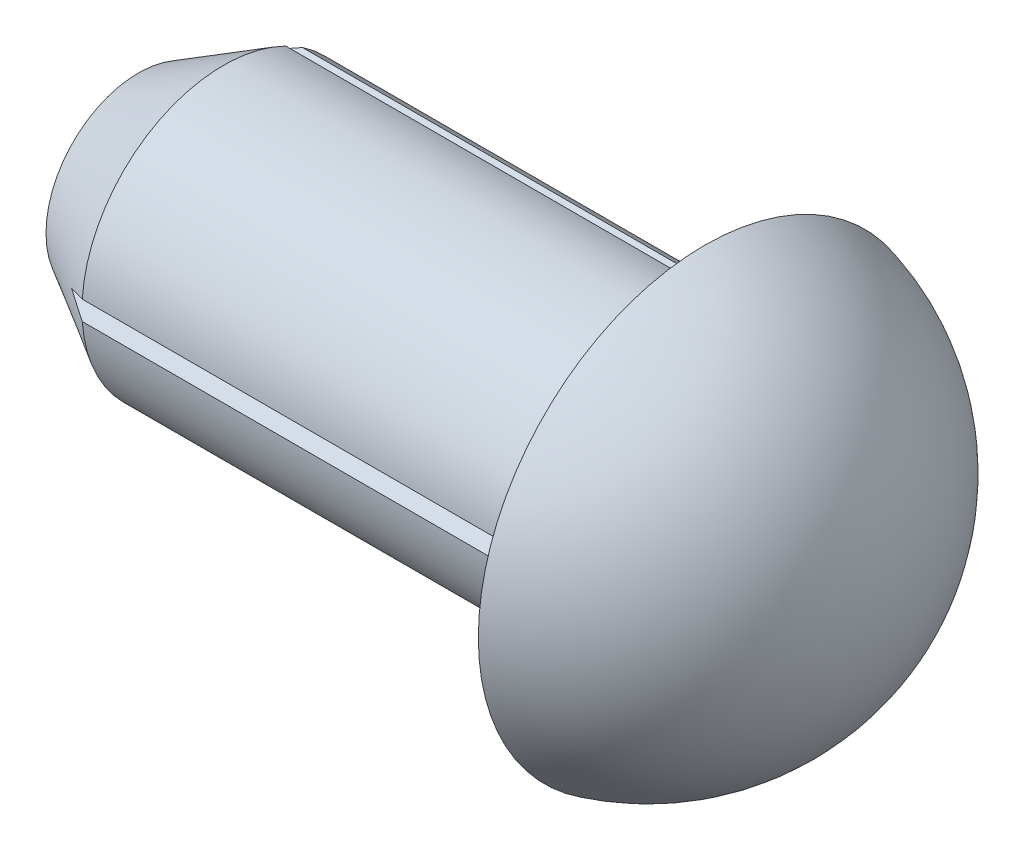
ISO-10303-21;
HEADER;
FILE_DESCRIPTION(('STEP AP214'),'2;1');
FILE_NAME('part.step','',(''),(''),'','','');
FILE_SCHEMA(('AUTOMOTIVE_DESIGN { 1 0 10303 214 1 1 1 1 }'));
ENDSEC;
DATA;
#1=APPLICATION_CONTEXT('core data for automotive mechanical design processes');
#2=APPLICATION_PROTOCOL_DEFINITION('international standard','automotive_design',2000,#1);
#3=PRODUCT_CONTEXT('',#1,'mechanical');
#4=PRODUCT('Part','Part','',(#3));
#5=PRODUCT_RELATED_PRODUCT_CATEGORY('part','',(#4));
#6=PRODUCT_DEFINITION_FORMATION('','',#4);
#7=PRODUCT_DEFINITION_CONTEXT('part definition',#1,'design');
#8=PRODUCT_DEFINITION('design','',#6,#7);
#9=PRODUCT_DEFINITION_SHAPE('','',#8);
#10=(LENGTH_UNIT() NAMED_UNIT(*) SI_UNIT(.MILLI.,.METRE.));
#11=(NAMED_UNIT(*) PLANE_ANGLE_UNIT() SI_UNIT($,.RADIAN.));
#12=(NAMED_UNIT(*) SI_UNIT($,.STERADIAN.) SOLID_ANGLE_UNIT());
#13=UNCERTAINTY_MEASURE_WITH_UNIT(LENGTH_MEASURE(1.E-05),#10,'distance_accuracy_value','');
#14=(GEOMETRIC_REPRESENTATION_CONTEXT(3) GLOBAL_UNCERTAINTY_ASSIGNED_CONTEXT((#13)) GLOBAL_UNIT_ASSIGNED_CONTEXT((#10,
#11,#12)) REPRESENTATION_CONTEXT('',''));
#15=CARTESIAN_POINT('',(0.,0.,0.));
#16=DIRECTION('',(0.,0.,1.));
#17=DIRECTION('',(1.,0.,0.));
#18=AXIS2_PLACEMENT_3D('',#15,#16,#17);
#19=CARTESIAN_POINT('',(-4.03112887414926,0.,0.));
#20=DIRECTION('',(-1.,0.,0.));
#21=DIRECTION('',(0.,1.,0.));
#22=AXIS2_PLACEMENT_3D('',#19,#20,#21);
#23=SPHERICAL_SURFACE('',#22,16.5);
#24=CARTESIAN_POINT('',(0.,0.,0.));
#25=DIRECTION('',(-1.,0.,0.));
#26=DIRECTION('',(0.,0.,1.));
#27=AXIS2_PLACEMENT_3D('',#24,#25,#26);
#28=CIRCLE('',#27,16.);
#29=CARTESIAN_POINT('',(0.,0.,16.));
#30=VERTEX_POINT('',#29);
#31=EDGE_CURVE('E160',#30,#30,#28,.T.);
#32=ORIENTED_EDGE('',*,*,#31,.F.);
#33=EDGE_LOOP('',(#32));
#34=FACE_BOUND('',#33,.T.);
#35=ADVANCED_FACE('F32',(#34),#23,.T.);
#36=CARTESIAN_POINT('',(0.,10.,0.));
#37=DIRECTION('',(1.,0.,0.));
#38=DIRECTION('',(0.,0.,-1.));
#39=AXIS2_PLACEMENT_3D('',#36,#37,#38);
#40=PLANE('',#39);
#41=CARTESIAN_POINT('',(0.,0.,0.));
#42=DIRECTION('',(-1.,0.,0.));
#43=DIRECTION('',(0.,0.,1.));
#44=AXIS2_PLACEMENT_3D('',#41,#42,#43);
#45=CIRCLE('',#44,10.);
#46=CARTESIAN_POINT('',(0.,0.,10.));
#47=VERTEX_POINT('',#46);
#48=EDGE_CURVE('E156',#47,#47,#45,.T.);
#49=ORIENTED_EDGE('',*,*,#48,.F.);
#50=EDGE_LOOP('',(#49));
#51=FACE_BOUND('',#50,.T.);
#52=ORIENTED_EDGE('',*,*,#31,.T.);
#53=EDGE_LOOP('',(#52));
#54=FACE_BOUND('',#53,.T.);
#55=ADVANCED_FACE('F204',(#51,#54),#40,.F.);
#56=CARTESIAN_POINT('',(-40.,0.,0.));
#57=DIRECTION('',(-1.,0.,0.));
#58=DIRECTION('',(0.,0.,1.));
#59=AXIS2_PLACEMENT_3D('',#56,#57,#58);
#60=CYLINDRICAL_SURFACE('',#59,10.);
#61=CARTESIAN_POINT('',(-3.,0.,0.));
#62=DIRECTION('',(-1.,0.,0.));
#63=DIRECTION('',(0.,0.,1.));
#64=AXIS2_PLACEMENT_3D('',#61,#62,#63);
#65=CIRCLE('',#64,10.);
#66=CARTESIAN_POINT('',(-3.,8.98189101971242,-4.39609300515917));
#67=VERTEX_POINT('',#66);
#68=CARTESIAN_POINT('',(-3.,8.29807372972323,-5.58049929451453));
#69=VERTEX_POINT('',#68);
#70=EDGE_CURVE('E11',#67,#69,#65,.T.);
#71=ORIENTED_EDGE('',*,*,#70,.F.);
#72=DIRECTION('',(-1.,0.,0.));
#73=VECTOR('',#72,1.);
#74=CARTESIAN_POINT('',(-40.,8.98189101971242,-4.39609300515917));
#75=LINE('',#74,#73);
#76=CARTESIAN_POINT('',(-34.,8.98189101971242,-4.39609300515917));
#77=VERTEX_POINT('',#76);
#78=EDGE_CURVE('E118',#67,#77,#75,.T.);
#79=ORIENTED_EDGE('',*,*,#78,.T.);
#80=CARTESIAN_POINT('',(-34.,0.,0.));
#81=DIRECTION('',(-1.,0.,0.));
#82=DIRECTION('',(0.,0.,1.));
#83=AXIS2_PLACEMENT_3D('',#80,#81,#82);
#84=CIRCLE('',#83,10.);
#85=CARTESIAN_POINT('',(-34.,0.683817289989198,9.97659229967386));
#86=VERTEX_POINT('',#85);
#87=EDGE_CURVE('E153',#86,#77,#84,.T.);
#88=ORIENTED_EDGE('',*,*,#87,.F.);
#89=DIRECTION('',(-1.,0.,0.));
#90=VECTOR('',#89,1.);
#91=CARTESIAN_POINT('',(-40.,0.683817289989198,9.97659229967386));
#92=LINE('',#91,#90);
#93=CARTESIAN_POINT('',(-3.,0.683817289989199,9.97659229967386));
#94=VERTEX_POINT('',#93);
#95=EDGE_CURVE('E143',#86,#94,#92,.F.);
#96=ORIENTED_EDGE('',*,*,#95,.T.);
#97=CARTESIAN_POINT('',(-3.,0.,0.));
#98=DIRECTION('',(-1.,0.,0.));
#99=DIRECTION('',(0.,0.,1.));
#100=AXIS2_PLACEMENT_3D('',#97,#98,#99);
#101=CIRCLE('',#100,10.);
#102=CARTESIAN_POINT('',(-3.,-0.683817289989198,9.97659229967386));
#103=VERTEX_POINT('',#102);
#104=EDGE_CURVE('E232',#103,#94,#101,.T.);
#105=ORIENTED_EDGE('',*,*,#104,.F.);
#106=DIRECTION('',(-1.,0.,0.));
#107=VECTOR('',#106,1.);
#108=CARTESIAN_POINT('',(-40.,-0.683817289989199,9.97659229967386));
#109=LINE('',#108,#107);
#110=CARTESIAN_POINT('',(-34.,-0.683817289989198,9.97659229967386));
#111=VERTEX_POINT('',#110);
#112=EDGE_CURVE('E146',#103,#111,#109,.T.);
#113=ORIENTED_EDGE('',*,*,#112,.T.);
#114=CARTESIAN_POINT('',(-34.,-8.98189101971236,-4.3960930051593));
#115=VERTEX_POINT('',#114);
#116=EDGE_CURVE('E152',#115,#111,#84,.T.);
#117=ORIENTED_EDGE('',*,*,#116,.F.);
#118=DIRECTION('',(-1.,0.,0.));
#119=VECTOR('',#118,1.);
#120=CARTESIAN_POINT('',(-40.,-8.98189101971236,-4.3960930051593));
#121=LINE('',#120,#119);
#122=CARTESIAN_POINT('',(-3.,-8.98189101971236,-4.3960930051593));
#123=VERTEX_POINT('',#122);
#124=EDGE_CURVE('E54',#115,#123,#121,.F.);
#125=ORIENTED_EDGE('',*,*,#124,.T.);
#126=CARTESIAN_POINT('',(-3.,0.,0.));
#127=DIRECTION('',(-1.,0.,0.));
#128=DIRECTION('',(0.,0.,1.));
#129=AXIS2_PLACEMENT_3D('',#126,#127,#128);
#130=CIRCLE('',#129,10.);
#131=CARTESIAN_POINT('',(-3.,-8.29807372972316,-5.58049929451465));
#132=VERTEX_POINT('',#131);
#133=EDGE_CURVE('E261',#132,#123,#130,.T.);
#134=ORIENTED_EDGE('',*,*,#133,.F.);
#135=DIRECTION('',(-1.,0.,0.));
#136=VECTOR('',#135,1.);
#137=CARTESIAN_POINT('',(-40.,-8.29807372972316,-5.58049929451465));
#138=LINE('',#137,#136);
#139=CARTESIAN_POINT('',(-34.,-8.29807372972316,-5.58049929451465));
#140=VERTEX_POINT('',#139);
#141=EDGE_CURVE('E132',#132,#140,#138,.T.);
#142=ORIENTED_EDGE('',*,*,#141,.T.);
#143=CARTESIAN_POINT('',(-34.,8.29807372972323,-5.58049929451453));
#144=VERTEX_POINT('',#143);
#145=EDGE_CURVE('E157',#144,#140,#84,.T.);
#146=ORIENTED_EDGE('',*,*,#145,.F.);
#147=DIRECTION('',(-1.,0.,0.));
#148=VECTOR('',#147,1.);
#149=CARTESIAN_POINT('',(-40.,8.29807372972323,-5.58049929451453));
#150=LINE('',#149,#148);
#151=EDGE_CURVE('E46',#144,#69,#150,.F.);
#152=ORIENTED_EDGE('',*,*,#151,.T.);
#153=EDGE_LOOP('',(#71,#79,#88,#96,#105,#113,#117,#125,#134,#142,#146,#152));
#154=FACE_BOUND('',#153,.T.);
#155=ORIENTED_EDGE('',*,*,#48,.T.);
#156=EDGE_LOOP('',(#155));
#157=FACE_BOUND('',#156,.T.);
#158=ADVANCED_FACE('F201',(#154,#157),#60,.T.);
#159=CARTESIAN_POINT('',(-34.,0.,0.));
#160=DIRECTION('',(1.,0.,0.));
#161=DIRECTION('',(0.,0.,-1.));
#162=AXIS2_PLACEMENT_3D('',#159,#160,#161);
#163=CONICAL_SURFACE('',#162,10.,0.523598775598299);
#164=CARTESIAN_POINT('',(-40.,0.,0.));
#165=DIRECTION('',(-1.,0.,0.));
#166=DIRECTION('',(0.,0.,1.));
#167=AXIS2_PLACEMENT_3D('',#164,#165,#166);
#168=CIRCLE('',#167,6.53589838486224);
#169=CARTESIAN_POINT('',(-40.,0.,6.53589838486224));
#170=VERTEX_POINT('',#169);
#171=EDGE_CURVE('E149',#170,#170,#168,.T.);
#172=ORIENTED_EDGE('',*,*,#171,.F.);
#173=EDGE_LOOP('',(#172));
#174=FACE_BOUND('',#173,.T.);
#175=ORIENTED_EDGE('',*,*,#87,.T.);
#176=CARTESIAN_POINT('',(-33.9998,8.98202532937215,-4.39608125458654));
#177=CARTESIAN_POINT('',(-34.145138501537,8.88442165387174,-4.4046204697113));
#178=CARTESIAN_POINT('',(-34.2902715740006,8.78651373635347,-4.41318630256358));
#179=CARTESIAN_POINT('',(-34.5800731071105,8.59002629577401,-4.4303767261395));
#180=CARTESIAN_POINT('',(-34.7247415801325,8.49144679082423,-4.43900131527861));
#181=CARTESIAN_POINT('',(-35.0135685789165,8.29354740294665,-4.45631526823662));
#182=CARTESIAN_POINT('',(-35.1577271025408,8.1942275169206,-4.46500463232659));
#183=CARTESIAN_POINT('',(-35.445474923103,7.99476476117974,-4.48245536224955));
#184=CARTESIAN_POINT('',(-35.5890642046376,7.89462186941734,-4.49121673001147));
#185=CARTESIAN_POINT('',(-35.7323356528118,7.79402863405999,-4.50001749773263));
#186=B_SPLINE_CURVE_WITH_KNOTS('',3,(#176,#177,#178,#179,#180,#181,#182,#183,#184,#185),
.UNSPECIFIED.,.F.,.F.,(4,2,2,2,4),(0.,0.52583670297349,1.05165928083963,1.57748406033221,
2.10332297241807),.UNSPECIFIED.);
#187=CARTESIAN_POINT('',(-35.7320508075689,7.79422863405999,-4.49999999999993));
#188=VERTEX_POINT('',#187);
#189=EDGE_CURVE('E39',#77,#188,#186,.T.);
#190=ORIENTED_EDGE('',*,*,#189,.T.);
#191=CARTESIAN_POINT('',(-35.7323639034054,7.79413537252836,-4.49979999999993));
#192=CARTESIAN_POINT('',(-35.5890901429984,7.8368110283531,-4.59131823925337));
#193=CARTESIAN_POINT('',(-35.4454985364308,7.87929562620335,-4.68242675335829));
#194=CARTESIAN_POINT('',(-35.1577460439412,7.96391565343207,-4.86389498736399));
#195=CARTESIAN_POINT('',(-35.0135851734236,8.00605109216458,-4.95425472732457));
#196=CARTESIAN_POINT('',(-34.7247534623418,8.09000786321399,-5.13430060386365));
#197=CARTESIAN_POINT('',(-34.5800826239155,8.13182919684538,-5.2239867432611));
#198=CARTESIAN_POINT('',(-34.2902763438265,8.21518695272155,-5.40274802761568));
#199=CARTESIAN_POINT('',(-34.1451408897872,8.25672336728229,-5.49182315609436));
#200=CARTESIAN_POINT('',(-33.9998000000001,8.29813070825876,-5.58062148537829));
#201=B_SPLINE_CURVE_WITH_KNOTS('',3,(#191,#192,#193,#194,#195,#196,#197,#198,#199,#200),
.UNSPECIFIED.,.F.,.F.,(4,2,2,2,4),(0.,0.525847553163812,1.05168097293757,1.57751219092272,
2.10335753481119),.UNSPECIFIED.);
#202=EDGE_CURVE('E111',#188,#144,#201,.T.);
#203=ORIENTED_EDGE('',*,*,#202,.T.);
#204=ORIENTED_EDGE('',*,*,#145,.T.);
#205=CARTESIAN_POINT('',(-33.9998,-8.29813070825861,-5.58062148537826));
#206=CARTESIAN_POINT('',(-34.1451408897872,-8.25672336728219,-5.49182315609442));
#207=CARTESIAN_POINT('',(-34.2902763438265,-8.21518695272146,-5.40274802761578));
#208=CARTESIAN_POINT('',(-34.5800826239155,-8.13182919684531,-5.22398674326123));
#209=CARTESIAN_POINT('',(-34.7247534623418,-8.09000786321392,-5.13430060386377));
#210=CARTESIAN_POINT('',(-35.0135851734236,-8.00605109216452,-4.95425472732468));
#211=CARTESIAN_POINT('',(-35.1577460439412,-7.963915653432,-4.8638949873641));
#212=CARTESIAN_POINT('',(-35.4454985364308,-7.87929562620328,-4.6824267533584));
#213=CARTESIAN_POINT('',(-35.5890901429984,-7.83681102835304,-4.59131823925349));
#214=CARTESIAN_POINT('',(-35.7323639034054,-7.7941353725283,-4.49980000000004));
#215=B_SPLINE_CURVE_WITH_KNOTS('',3,(#205,#206,#207,#208,#209,#210,#211,#212,#213,#214),
.UNSPECIFIED.,.F.,.F.,(4,2,2,2,4),(0.,0.525845343888464,1.05167656187362,1.57750998164738,
2.10335753481119),.UNSPECIFIED.);
#216=CARTESIAN_POINT('',(-35.7320508075689,-7.79422863405993,-4.50000000000004));
#217=VERTEX_POINT('',#216);
#218=EDGE_CURVE('E235',#140,#217,#215,.T.);
#219=ORIENTED_EDGE('',*,*,#218,.T.);
#220=CARTESIAN_POINT('',(-35.7323356528118,-7.79402863405993,-4.50001749773274));
#221=CARTESIAN_POINT('',(-35.5890642046376,-7.89462186941727,-4.49121673001158));
#222=CARTESIAN_POINT('',(-35.445474923103,-7.99476476117967,-4.48245536224967));
#223=CARTESIAN_POINT('',(-35.1577271025408,-8.19422751692053,-4.4650046323267));
#224=CARTESIAN_POINT('',(-35.0135685789165,-8.29354740294659,-4.45631526823674));
#225=CARTESIAN_POINT('',(-34.7247415801325,-8.49144679082416,-4.43900131527873));
#226=CARTESIAN_POINT('',(-34.5800731071105,-8.59002629577393,-4.43037672613963));
#227=CARTESIAN_POINT('',(-34.2902715740006,-8.78651373635342,-4.4131863025637));
#228=CARTESIAN_POINT('',(-34.145138501537,-8.88442165387173,-4.40462046971141));
#229=CARTESIAN_POINT('',(-33.9998000000001,-8.98202532937224,-4.39608125458666));
#230=B_SPLINE_CURVE_WITH_KNOTS('',3,(#220,#221,#222,#223,#224,#225,#226,#227,#228,#229),
.UNSPECIFIED.,.F.,.F.,(4,2,2,2,4),(0.,0.525838912085855,1.05166369157844,1.57748626944458,
2.10332297241807),.UNSPECIFIED.);
#231=EDGE_CURVE('E229',#217,#115,#230,.T.);
#232=ORIENTED_EDGE('',*,*,#231,.T.);
#233=ORIENTED_EDGE('',*,*,#116,.T.);
#234=CARTESIAN_POINT('',(-33.9998,-0.683894621113468,9.97670273996485));
#235=CARTESIAN_POINT('',(-34.1451437059567,-0.627695593648227,9.89644221090952));
#236=CARTESIAN_POINT('',(-34.2902819682951,-0.571321381113208,9.81593149164598));
#237=CARTESIAN_POINT('',(-34.5800938459117,-0.458186238500075,9.65435776323054));
#238=CARTESIAN_POINT('',(-34.7247674735676,-0.401425318851616,9.57329476897375));
#239=CARTESIAN_POINT('',(-35.0136047412808,-0.287477160579626,9.41055993386567));
#240=CARTESIAN_POINT('',(-35.1577683791998,-0.230289920171865,9.32888809046625));
#241=CARTESIAN_POINT('',(-35.4455263807158,-0.115441552961599,9.16486762375732));
#242=CARTESIAN_POINT('',(-35.5891207289068,-0.0577804134626578,9.08251898231543));
#243=CARTESIAN_POINT('',(-35.7323972158432,0.000140041507644462,8.9998));
#244=B_SPLINE_CURVE_WITH_KNOTS('',3,(#234,#235,#236,#237,#238,#239,#240,#241,#242,#243),
.UNSPECIFIED.,.F.,.F.,(4,2,2,2,4),(0.,0.525855533056186,1.05169693927042,1.57754054746447,
2.10339828998818),.UNSPECIFIED.);
#245=CARTESIAN_POINT('',(-35.7320508075689,0.,9.));
#246=VERTEX_POINT('',#245);
#247=EDGE_CURVE('E171',#111,#246,#244,.T.);
#248=ORIENTED_EDGE('',*,*,#247,.T.);
#249=CARTESIAN_POINT('',(-35.7323972158432,-0.000140041507642325,8.9998));
#250=CARTESIAN_POINT('',(-35.5891207289068,0.0577804134626586,9.08251898231543));
#251=CARTESIAN_POINT('',(-35.4455263807158,0.115441552961604,9.16486762375733));
#252=CARTESIAN_POINT('',(-35.1577683791998,0.230289920171879,9.32888809046627));
#253=CARTESIAN_POINT('',(-35.0136047412807,0.287477160579645,9.4105599338657));
#254=CARTESIAN_POINT('',(-34.7247674735676,0.401425318851636,9.57329476897378));
#255=CARTESIAN_POINT('',(-34.5800938459116,0.458186238500091,9.65435776323057));
#256=CARTESIAN_POINT('',(-34.290281968295,0.571321381113247,9.81593149164603));
#257=CARTESIAN_POINT('',(-34.1451437059567,0.627695593648293,9.89644221090961));
#258=CARTESIAN_POINT('',(-33.9998,0.683894621113594,9.97670273996503));
#259=B_SPLINE_CURVE_WITH_KNOTS('',3,(#249,#250,#251,#252,#253,#254,#255,#256,#257,#258),
.UNSPECIFIED.,.F.,.F.,(4,2,2,2,4),(0.,0.525857742523741,1.05170135071782,1.57754275693208,
2.10339828998829),.UNSPECIFIED.);
#260=EDGE_CURVE('E163',#246,#86,#259,.T.);
#261=ORIENTED_EDGE('',*,*,#260,.T.);
#262=EDGE_LOOP('',(#175,#190,#203,#204,#219,#232,#233,#248,#261));
#263=FACE_BOUND('',#262,.T.);
#264=ADVANCED_FACE('F177',(#174,#263),#163,.T.);
#265=CARTESIAN_POINT('',(-40.,0.,0.));
#266=DIRECTION('',(1.,0.,0.));
#267=DIRECTION('',(0.,0.,-1.));
#268=AXIS2_PLACEMENT_3D('',#265,#266,#267);
#269=PLANE('',#268);
#270=ORIENTED_EDGE('',*,*,#171,.T.);
#271=EDGE_LOOP('',(#270));
#272=FACE_BOUND('',#271,.T.);
#273=ADVANCED_FACE('F193',(#272),#269,.F.);
#274=CARTESIAN_POINT('',(-3.,0.,9.));
#275=DIRECTION('',(-1.,0.,0.));
#276=DIRECTION('',(0.,0.,1.));
#277=AXIS2_PLACEMENT_3D('',#274,#275,#276);
#278=PLANE('',#277);
#279=ORIENTED_EDGE('',*,*,#104,.T.);
#280=DIRECTION('',(0.,-0.573576436351047,-0.819152044288991));
#281=VECTOR('',#280,1.);
#282=CARTESIAN_POINT('',(-3.,0.,9.));
#283=LINE('',#282,#281);
#284=CARTESIAN_POINT('',(-3.,0.,9.));
#285=VERTEX_POINT('',#284);
#286=EDGE_CURVE('E138',#94,#285,#283,.T.);
#287=ORIENTED_EDGE('',*,*,#286,.T.);
#288=DIRECTION('',(0.,-0.573576436351047,0.819152044288991));
#289=VECTOR('',#288,1.);
#290=CARTESIAN_POINT('',(-3.,0.,9.));
#291=LINE('',#290,#289);
#292=EDGE_CURVE('E135',#285,#103,#291,.T.);
#293=ORIENTED_EDGE('',*,*,#292,.T.);
#294=EDGE_LOOP('',(#279,#287,#293));
#295=FACE_BOUND('',#294,.T.);
#296=ADVANCED_FACE('F188',(#295),#278,.T.);
#297=CARTESIAN_POINT('',(-3.,0.,9.));
#298=DIRECTION('',(0.,-0.819152044288991,-0.573576436351047));
#299=DIRECTION('',(0.,0.573576436351047,-0.819152044288991));
#300=AXIS2_PLACEMENT_3D('',#297,#298,#299);
#301=PLANE('',#300);
#302=ORIENTED_EDGE('',*,*,#292,.F.);
#303=DIRECTION('',(-1.,0.,0.));
#304=VECTOR('',#303,1.);
#305=CARTESIAN_POINT('',(-3.,0.,9.));
#306=LINE('',#305,#304);
#307=EDGE_CURVE('E140',#285,#246,#306,.T.);
#308=ORIENTED_EDGE('',*,*,#307,.T.);
#309=ORIENTED_EDGE('',*,*,#247,.F.);
#310=ORIENTED_EDGE('',*,*,#112,.F.);
#311=EDGE_LOOP('',(#302,#308,#309,#310));
#312=FACE_BOUND('',#311,.T.);
#313=ADVANCED_FACE('F186',(#312),#301,.F.);
#314=CARTESIAN_POINT('',(-3.,0.,9.));
#315=DIRECTION('',(0.,0.819152044288991,-0.573576436351048));
#316=DIRECTION('',(0.,0.573576436351048,0.819152044288991));
#317=AXIS2_PLACEMENT_3D('',#314,#315,#316);
#318=PLANE('',#317);
#319=ORIENTED_EDGE('',*,*,#260,.F.);
#320=ORIENTED_EDGE('',*,*,#307,.F.);
#321=ORIENTED_EDGE('',*,*,#286,.F.);
#322=ORIENTED_EDGE('',*,*,#95,.F.);
#323=EDGE_LOOP('',(#319,#320,#321,#322));
#324=FACE_BOUND('',#323,.T.);
#325=ADVANCED_FACE('F181',(#324),#318,.F.);
#326=CARTESIAN_POINT('',(-3.,-7.79422863405993,-4.50000000000004));
#327=DIRECTION('',(-1.,0.,0.));
#328=DIRECTION('',(0.,-0.866025403784436,-0.500000000000004));
#329=AXIS2_PLACEMENT_3D('',#326,#327,#328);
#330=PLANE('',#329);
#331=DIRECTION('',(0.,-0.422618261740694,-0.906307787036653));
#332=VECTOR('',#331,1.);
#333=CARTESIAN_POINT('',(-3.,-7.79422863405993,-4.50000000000004));
#334=LINE('',#333,#332);
#335=CARTESIAN_POINT('',(-3.,-7.79422863405993,-4.50000000000004));
#336=VERTEX_POINT('',#335);
#337=EDGE_CURVE('E123',#336,#132,#334,.T.);
#338=ORIENTED_EDGE('',*,*,#337,.T.);
#339=ORIENTED_EDGE('',*,*,#133,.T.);
#340=DIRECTION('',(0.,0.996194698091746,-0.0871557427476553));
#341=VECTOR('',#340,1.);
#342=CARTESIAN_POINT('',(-3.,-7.79422863405993,-4.50000000000004));
#343=LINE('',#342,#341);
#344=EDGE_CURVE('E126',#123,#336,#343,.T.);
#345=ORIENTED_EDGE('',*,*,#344,.T.);
#346=EDGE_LOOP('',(#338,#339,#345));
#347=FACE_BOUND('',#346,.T.);
#348=ADVANCED_FACE('F185',(#347),#330,.T.);
#349=CARTESIAN_POINT('',(-3.,-7.79422863405993,-4.50000000000004));
#350=DIRECTION('',(0.,0.906307787036652,-0.422618261740694));
#351=DIRECTION('',(0.,0.422618261740694,0.906307787036652));
#352=AXIS2_PLACEMENT_3D('',#349,#350,#351);
#353=PLANE('',#352);
#354=ORIENTED_EDGE('',*,*,#337,.F.);
#355=DIRECTION('',(-1.,0.,0.));
#356=VECTOR('',#355,1.);
#357=CARTESIAN_POINT('',(-3.,-7.79422863405993,-4.50000000000004));
#358=LINE('',#357,#356);
#359=EDGE_CURVE('E128',#336,#217,#358,.T.);
#360=ORIENTED_EDGE('',*,*,#359,.T.);
#361=ORIENTED_EDGE('',*,*,#218,.F.);
#362=ORIENTED_EDGE('',*,*,#141,.F.);
#363=EDGE_LOOP('',(#354,#360,#361,#362));
#364=FACE_BOUND('',#363,.T.);
#365=ADVANCED_FACE('F250',(#364),#353,.F.);
#366=CARTESIAN_POINT('',(-3.,-7.79422863405993,-4.50000000000004));
#367=DIRECTION('',(0.,0.0871557427476553,0.996194698091746));
#368=DIRECTION('',(0.,-0.996194698091746,0.0871557427476553));
#369=AXIS2_PLACEMENT_3D('',#366,#367,#368);
#370=PLANE('',#369);
#371=ORIENTED_EDGE('',*,*,#231,.F.);
#372=ORIENTED_EDGE('',*,*,#359,.F.);
#373=ORIENTED_EDGE('',*,*,#344,.F.);
#374=ORIENTED_EDGE('',*,*,#124,.F.);
#375=EDGE_LOOP('',(#371,#372,#373,#374));
#376=FACE_BOUND('',#375,.T.);
#377=ADVANCED_FACE('F246',(#376),#370,.F.);
#378=CARTESIAN_POINT('',(-3.,7.79422863405999,-4.49999999999993));
#379=DIRECTION('',(-1.,0.,0.));
#380=DIRECTION('',(0.,0.866025403784443,-0.499999999999992));
#381=AXIS2_PLACEMENT_3D('',#378,#379,#380);
#382=PLANE('',#381);
#383=DIRECTION('',(0.,0.996194698091744,0.0871557427476688));
#384=VECTOR('',#383,1.);
#385=CARTESIAN_POINT('',(-3.,7.79422863405999,-4.49999999999993));
#386=LINE('',#385,#384);
#387=CARTESIAN_POINT('',(-3.,7.79422863405999,-4.49999999999993));
#388=VERTEX_POINT('',#387);
#389=EDGE_CURVE('E106',#388,#67,#386,.T.);
#390=ORIENTED_EDGE('',*,*,#389,.T.);
#391=ORIENTED_EDGE('',*,*,#70,.T.);
#392=DIRECTION('',(0.,-0.422618261740706,0.906307787036647));
#393=VECTOR('',#392,1.);
#394=CARTESIAN_POINT('',(-3.,7.79422863405999,-4.49999999999993));
#395=LINE('',#394,#393);
#396=EDGE_CURVE('E102',#69,#388,#395,.T.);
#397=ORIENTED_EDGE('',*,*,#396,.T.);
#398=EDGE_LOOP('',(#390,#391,#397));
#399=FACE_BOUND('',#398,.T.);
#400=ADVANCED_FACE('F104',(#399),#382,.T.);
#401=CARTESIAN_POINT('',(-3.,7.79422863405999,-4.49999999999993));
#402=DIRECTION('',(0.,-0.0871557427476688,0.996194698091745));
#403=DIRECTION('',(0.,-0.996194698091745,-0.0871557427476688));
#404=AXIS2_PLACEMENT_3D('',#401,#402,#403);
#405=PLANE('',#404);
#406=ORIENTED_EDGE('',*,*,#389,.F.);
#407=DIRECTION('',(-1.,0.,0.));
#408=VECTOR('',#407,1.);
#409=CARTESIAN_POINT('',(-3.,7.79422863405999,-4.49999999999993));
#410=LINE('',#409,#408);
#411=EDGE_CURVE('E107',#388,#188,#410,.T.);
#412=ORIENTED_EDGE('',*,*,#411,.T.);
#413=ORIENTED_EDGE('',*,*,#189,.F.);
#414=ORIENTED_EDGE('',*,*,#78,.F.);
#415=EDGE_LOOP('',(#406,#412,#413,#414));
#416=FACE_BOUND('',#415,.T.);
#417=ADVANCED_FACE('F116',(#416),#405,.F.);
#418=CARTESIAN_POINT('',(-3.,7.79422863405999,-4.49999999999993));
#419=DIRECTION('',(0.,-0.906307787036647,-0.422618261740706));
#420=DIRECTION('',(0.,0.422618261740706,-0.906307787036647));
#421=AXIS2_PLACEMENT_3D('',#418,#419,#420);
#422=PLANE('',#421);
#423=ORIENTED_EDGE('',*,*,#202,.F.);
#424=ORIENTED_EDGE('',*,*,#411,.F.);
#425=ORIENTED_EDGE('',*,*,#396,.F.);
#426=ORIENTED_EDGE('',*,*,#151,.F.);
#427=EDGE_LOOP('',(#423,#424,#425,#426));
#428=FACE_BOUND('',#427,.T.);
#429=ADVANCED_FACE('F110',(#428),#422,.F.);
#430=CLOSED_SHELL('',(#35,#55,#158,#264,#273,#296,#313,#325,#348,#365,#377,#400,#417,#429));
#431=MANIFOLD_SOLID_BREP('B2',#430);
#432=ADVANCED_BREP_SHAPE_REPRESENTATION('',(#18,#431),#14);
#433=SHAPE_DEFINITION_REPRESENTATION(#9,#432);
ENDSEC;
END-ISO-10303-21;
